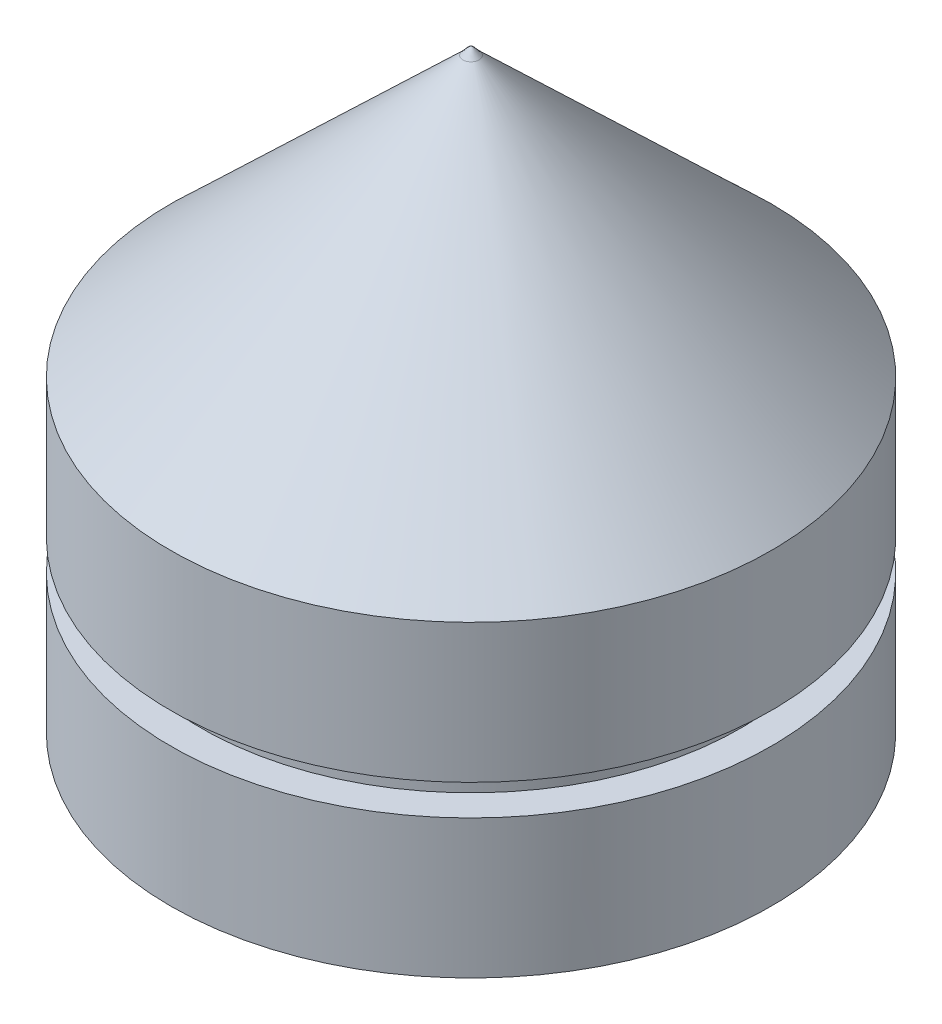
ISO-10303-21;
HEADER;
FILE_DESCRIPTION(('STEP AP214'),'2;1');
FILE_NAME('part.step','',(''),(''),'','','');
FILE_SCHEMA(('AUTOMOTIVE_DESIGN { 1 0 10303 214 1 1 1 1 }'));
ENDSEC;
DATA;
#1=APPLICATION_CONTEXT('core data for automotive mechanical design processes');
#2=APPLICATION_PROTOCOL_DEFINITION('international standard','automotive_design',2000,#1);
#3=PRODUCT_CONTEXT('',#1,'mechanical');
#4=PRODUCT('Part','Part','',(#3));
#5=PRODUCT_RELATED_PRODUCT_CATEGORY('part','',(#4));
#6=PRODUCT_DEFINITION_FORMATION('','',#4);
#7=PRODUCT_DEFINITION_CONTEXT('part definition',#1,'design');
#8=PRODUCT_DEFINITION('design','',#6,#7);
#9=PRODUCT_DEFINITION_SHAPE('','',#8);
#10=(LENGTH_UNIT() NAMED_UNIT(*) SI_UNIT(.MILLI.,.METRE.));
#11=(NAMED_UNIT(*) PLANE_ANGLE_UNIT() SI_UNIT($,.RADIAN.));
#12=(NAMED_UNIT(*) SI_UNIT($,.STERADIAN.) SOLID_ANGLE_UNIT());
#13=UNCERTAINTY_MEASURE_WITH_UNIT(LENGTH_MEASURE(1.E-05),#10,'distance_accuracy_value','');
#14=(GEOMETRIC_REPRESENTATION_CONTEXT(3) GLOBAL_UNCERTAINTY_ASSIGNED_CONTEXT((#13)) GLOBAL_UNIT_ASSIGNED_CONTEXT((#10,
#11,#12)) REPRESENTATION_CONTEXT('',''));
#15=CARTESIAN_POINT('',(0.,0.,0.));
#16=DIRECTION('',(0.,0.,1.));
#17=DIRECTION('',(1.,0.,0.));
#18=AXIS2_PLACEMENT_3D('',#15,#16,#17);
#19=CARTESIAN_POINT('',(0.,10.,0.));
#20=DIRECTION('',(0.,-1.,0.));
#21=DIRECTION('',(0.,0.,-1.));
#22=AXIS2_PLACEMENT_3D('',#19,#20,#21);
#23=CYLINDRICAL_SURFACE('',#22,9.75);
#24=CARTESIAN_POINT('',(0.,10.,0.));
#25=DIRECTION('',(0.,1.,0.));
#26=DIRECTION('',(0.,0.,1.));
#27=AXIS2_PLACEMENT_3D('',#24,#25,#26);
#28=CIRCLE('',#27,9.75);
#29=CARTESIAN_POINT('',(0.,10.,-9.75));
#30=VERTEX_POINT('',#29);
#31=EDGE_CURVE('E11',#30,#30,#28,.T.);
#32=ORIENTED_EDGE('',*,*,#31,.F.);
#33=EDGE_LOOP('',(#32));
#34=FACE_BOUND('',#33,.T.);
#35=CARTESIAN_POINT('',(0.,5.5,0.));
#36=DIRECTION('',(0.,-1.,0.));
#37=DIRECTION('',(0.,0.,-1.));
#38=AXIS2_PLACEMENT_3D('',#35,#36,#37);
#39=CIRCLE('',#38,9.75);
#40=CARTESIAN_POINT('',(0.,5.5,-9.75));
#41=VERTEX_POINT('',#40);
#42=EDGE_CURVE('E99',#41,#41,#39,.T.);
#43=ORIENTED_EDGE('',*,*,#42,.F.);
#44=EDGE_LOOP('',(#43));
#45=FACE_BOUND('',#44,.T.);
#46=ADVANCED_FACE('F39',(#34,#45),#23,.T.);
#47=CARTESIAN_POINT('',(0.,10.,0.));
#48=DIRECTION('',(0.,-1.,0.));
#49=DIRECTION('',(0.,0.,-1.));
#50=AXIS2_PLACEMENT_3D('',#47,#48,#49);
#51=CONICAL_SURFACE('',#50,9.75,0.809005552107021);
#52=CARTESIAN_POINT('',(0.,19.0501911681891,0.));
#53=DIRECTION('',(0.,1.,0.));
#54=DIRECTION('',(-1.,0.,0.));
#55=AXIS2_PLACEMENT_3D('',#52,#53,#54);
#56=CIRCLE('',#55,0.262091386716583);
#57=CARTESIAN_POINT('',(0.,19.0501911681891,-0.262091386716581));
#58=VERTEX_POINT('',#57);
#59=EDGE_CURVE('E57',#58,#58,#56,.T.);
#60=CARTESIAN_POINT('',(0.,19.0501911681891,-0.262091386716581));
#61=CARTESIAN_POINT('',(0.,18.9559183435205,-0.36092376810495));
#62=CARTESIAN_POINT('',(0.,18.8616455188518,-0.459756149493319));
#63=CARTESIAN_POINT('',(0.,18.6730998695146,-0.657420912270057));
#64=CARTESIAN_POINT('',(0.,18.5788270448459,-0.756253293658426));
#65=CARTESIAN_POINT('',(0.,18.3902813955087,-0.953918056435164));
#66=CARTESIAN_POINT('',(0.,18.29600857084,-1.05275043782353));
#67=CARTESIAN_POINT('',(0.,18.1074629215027,-1.25041520060027));
#68=CARTESIAN_POINT('',(0.,18.0131900968341,-1.34924758198864));
#69=CARTESIAN_POINT('',(0.,17.8246444474968,-1.54691234476538));
#70=CARTESIAN_POINT('',(0.,17.7303716228282,-1.64574472615375));
#71=CARTESIAN_POINT('',(0.,17.5418259734909,-1.84340948893048));
#72=CARTESIAN_POINT('',(0.,17.4475531488223,-1.94224187031885));
#73=CARTESIAN_POINT('',(0.,17.259007499485,-2.13990663309559));
#74=CARTESIAN_POINT('',(0.,17.1647346748164,-2.23873901448396));
#75=CARTESIAN_POINT('',(0.,16.9761890254791,-2.4364037772607));
#76=CARTESIAN_POINT('',(0.,16.8819162008105,-2.53523615864907));
#77=CARTESIAN_POINT('',(0.,16.6933705514732,-2.7329009214258));
#78=CARTESIAN_POINT('',(0.,16.5990977268046,-2.83173330281417));
#79=CARTESIAN_POINT('',(0.,16.4105520774673,-3.02939806559091));
#80=CARTESIAN_POINT('',(0.,16.3162792527987,-3.12823044697928));
#81=CARTESIAN_POINT('',(0.,16.1277336034614,-3.32589520975602));
#82=CARTESIAN_POINT('',(0.,16.0334607787927,-3.42472759114439));
#83=CARTESIAN_POINT('',(0.,15.8449151294555,-3.62239235392113));
#84=CARTESIAN_POINT('',(0.,15.7506423047868,-3.72122473530949));
#85=CARTESIAN_POINT('',(0.,15.5620966554496,-3.91888949808623));
#86=CARTESIAN_POINT('',(0.,15.4678238307809,-4.0177218794746));
#87=CARTESIAN_POINT('',(0.,15.2792781814436,-4.21538664225134));
#88=CARTESIAN_POINT('',(0.,15.185005356775,-4.31421902363971));
#89=CARTESIAN_POINT('',(0.,14.9964597074377,-4.51188378641645));
#90=CARTESIAN_POINT('',(0.,14.9021868827691,-4.61071616780482));
#91=CARTESIAN_POINT('',(0.,14.7136412334318,-4.80838093058155));
#92=CARTESIAN_POINT('',(0.,14.6193684087632,-4.90721331196992));
#93=CARTESIAN_POINT('',(0.,14.4308227594259,-5.10487807474666));
#94=CARTESIAN_POINT('',(0.,14.3365499347573,-5.20371045613503));
#95=CARTESIAN_POINT('',(0.,14.14800428542,-5.40137521891177));
#96=CARTESIAN_POINT('',(0.,14.0537314607514,-5.50020760030014));
#97=CARTESIAN_POINT('',(0.,13.8651858114141,-5.69787236307687));
#98=CARTESIAN_POINT('',(0.,13.7709129867455,-5.79670474446524));
#99=CARTESIAN_POINT('',(0.,13.5823673374082,-5.99436950724198));
#100=CARTESIAN_POINT('',(0.,13.4880945127396,-6.09320188863035));
#101=CARTESIAN_POINT('',(0.,13.2995488634023,-6.29086665140709));
#102=CARTESIAN_POINT('',(0.,13.2052760387336,-6.38969903279546));
#103=CARTESIAN_POINT('',(0.,13.0167303893964,-6.5873637955722));
#104=CARTESIAN_POINT('',(0.,12.9224575647277,-6.68619617696056));
#105=CARTESIAN_POINT('',(0.,12.7339119153905,-6.8838609397373));
#106=CARTESIAN_POINT('',(0.,12.6396390907218,-6.98269332112567));
#107=CARTESIAN_POINT('',(0.,12.4510934413845,-7.18035808390241));
#108=CARTESIAN_POINT('',(0.,12.3568206167159,-7.27919046529078));
#109=CARTESIAN_POINT('',(0.,12.1682749673786,-7.47685522806752));
#110=CARTESIAN_POINT('',(0.,12.07400214271,-7.57568760945588));
#111=CARTESIAN_POINT('',(0.,11.8854564933727,-7.77335237223262));
#112=CARTESIAN_POINT('',(0.,11.7911836687041,-7.87218475362099));
#113=CARTESIAN_POINT('',(0.,11.6026380193668,-8.06984951639773));
#114=CARTESIAN_POINT('',(0.,11.5083651946982,-8.1686818977861));
#115=CARTESIAN_POINT('',(0.,11.3198195453609,-8.36634666056283));
#116=CARTESIAN_POINT('',(0.,11.2255467206923,-8.4651790419512));
#117=CARTESIAN_POINT('',(0.,11.037001071355,-8.66284380472794));
#118=CARTESIAN_POINT('',(0.,10.9427282466864,-8.76167618611631));
#119=CARTESIAN_POINT('',(0.,10.7541825973491,-8.95934094889305));
#120=CARTESIAN_POINT('',(0.,10.6599097726805,-9.05817333028142));
#121=CARTESIAN_POINT('',(0.,10.4713641233432,-9.25583809305816));
#122=CARTESIAN_POINT('',(0.,10.3770912986745,-9.35467047444653));
#123=CARTESIAN_POINT('',(0.,10.1885456493373,-9.55233523722326));
#124=CARTESIAN_POINT('',(0.,10.0942728246686,-9.65116761861163));
#125=CARTESIAN_POINT('',(0.,10.,-9.75));
#126=B_SPLINE_CURVE_WITH_KNOTS('',3,(#60,#61,#62,#63,#64,#65,#66,#67,#68,#69,#70,#71,#72,#73,
#74,#75,#76,#77,#78,#79,#80,#81,#82,#83,#84,#85,#86,#87,#88,#89,#90,#91,#92,#93,#94,#95,#96,#97,
#98,#99,#100,#101,#102,#103,#104,#105,#106,#107,#108,#109,#110,#111,#112,#113,#114,#115,#116,
#117,#118,#119,#120,#121,#122,#123,#124,#125),.UNSPECIFIED.,.F.,.F.,(4,2,2,2,2,2,2,2,2,2,2,2,2,
2,2,2,2,2,2,2,2,2,2,2,2,2,2,2,2,2,2,2,4),(0.,0.409752176000439,0.819504352000878,
1.22925652800132,1.63900870400176,2.0487608800022,2.45851305600264,2.86826523200308,
3.27801740800352,3.68776958400396,4.0975217600044,4.50727393600484,4.91702611200528,
5.32677828800572,5.73653046400616,6.1462826400066,6.55603481600704,6.96578699200748,
7.37553916800792,7.78529134400836,8.1950435200088,8.60479569600924,9.01454787200968,
9.42430004801012,9.83405222401056,10.243804400011,10.6535565760114,11.0633087520119,
11.4730609280123,11.8828131040128,12.2925652800132,12.7023174560136,13.1120696320141),.UNSPECIFIED.);
#127=EDGE_CURVE('BSEAM53',#58,#30,#126,.T.);
#128=ORIENTED_EDGE('',*,*,#59,.F.);
#129=ORIENTED_EDGE('',*,*,#31,.T.);
#130=ORIENTED_EDGE('',*,*,#127,.T.);
#131=ORIENTED_EDGE('',*,*,#127,.F.);
#132=EDGE_LOOP('',(#128,#130,#129,#131));
#133=FACE_BOUND('',#132,.T.);
#134=ADVANCED_FACE('F53',(#133),#51,.T.);
#135=CARTESIAN_POINT('',(0.262091386716583,19.0501911681891,0.));
#136=CARTESIAN_POINT('',(0.134000153035224,19.1894724348722,0.));
#137=CARTESIAN_POINT('',(0.0703602224921844,19.2864984681918,0.));
#138=CARTESIAN_POINT('',(0.,19.3001911681891,0.));
#139=B_SPLINE_CURVE_WITH_KNOTS('',3,(#135,#136,#137,#138),.UNSPECIFIED.,.F.,.F.,(4,4),
(0.500000000033375,1.),.UNSPECIFIED.);
#140=CARTESIAN_POINT('',(0.,19.0501911681891,0.));
#141=DIRECTION('',(0.,1.,0.));
#142=AXIS1_PLACEMENT('',#140,#141);
#143=SURFACE_OF_REVOLUTION('',#139,#142);
#144=CARTESIAN_POINT('',(0.,19.3001911681891,0.));
#145=VERTEX_POINT('',#144);
#146=VERTEX_LOOP('',#145);
#147=FACE_BOUND('',#146,.T.);
#148=ORIENTED_EDGE('',*,*,#59,.T.);
#149=EDGE_LOOP('',(#148));
#150=FACE_BOUND('',#149,.T.);
#151=ADVANCED_FACE('F49',(#147,#150),#143,.T.);
#152=CARTESIAN_POINT('',(-8.75,4.5,0.));
#153=DIRECTION('',(0.,1.,0.));
#154=DIRECTION('',(0.,0.,1.));
#155=AXIS2_PLACEMENT_3D('',#152,#153,#154);
#156=PLANE('',#155);
#157=CARTESIAN_POINT('',(0.,4.5,0.));
#158=DIRECTION('',(0.,-1.,0.));
#159=DIRECTION('',(0.,0.,-1.));
#160=AXIS2_PLACEMENT_3D('',#157,#158,#159);
#161=CIRCLE('',#160,8.75);
#162=CARTESIAN_POINT('',(0.,4.5,-8.75));
#163=VERTEX_POINT('',#162);
#164=EDGE_CURVE('E59',#163,#163,#161,.T.);
#165=ORIENTED_EDGE('',*,*,#164,.T.);
#166=EDGE_LOOP('',(#165));
#167=FACE_BOUND('',#166,.T.);
#168=CARTESIAN_POINT('',(0.,4.5,0.));
#169=DIRECTION('',(0.,-1.,0.));
#170=DIRECTION('',(0.,0.,-1.));
#171=AXIS2_PLACEMENT_3D('',#168,#169,#170);
#172=CIRCLE('',#171,9.75);
#173=CARTESIAN_POINT('',(0.,4.5,-9.75));
#174=VERTEX_POINT('',#173);
#175=EDGE_CURVE('E100',#174,#174,#172,.T.);
#176=ORIENTED_EDGE('',*,*,#175,.F.);
#177=EDGE_LOOP('',(#176));
#178=FACE_BOUND('',#177,.T.);
#179=ADVANCED_FACE('F52',(#167,#178),#156,.T.);
#180=CARTESIAN_POINT('',(0.,0.,0.));
#181=DIRECTION('',(0.,-1.,0.));
#182=DIRECTION('',(0.,0.,-1.));
#183=AXIS2_PLACEMENT_3D('',#180,#181,#182);
#184=CYLINDRICAL_SURFACE('',#183,8.75);
#185=CARTESIAN_POINT('',(0.,5.5,0.));
#186=DIRECTION('',(0.,-1.,0.));
#187=DIRECTION('',(0.,0.,-1.));
#188=AXIS2_PLACEMENT_3D('',#185,#186,#187);
#189=CIRCLE('',#188,8.75);
#190=CARTESIAN_POINT('',(0.,5.5,-8.75));
#191=VERTEX_POINT('',#190);
#192=EDGE_CURVE('E63',#191,#191,#189,.T.);
#193=ORIENTED_EDGE('',*,*,#192,.T.);
#194=EDGE_LOOP('',(#193));
#195=FACE_BOUND('',#194,.T.);
#196=ORIENTED_EDGE('',*,*,#164,.F.);
#197=EDGE_LOOP('',(#196));
#198=FACE_BOUND('',#197,.T.);
#199=ADVANCED_FACE('F86',(#195,#198),#184,.T.);
#200=CARTESIAN_POINT('',(-9.75,5.5,0.));
#201=DIRECTION('',(0.,-1.,0.));
#202=DIRECTION('',(0.,0.,-1.));
#203=AXIS2_PLACEMENT_3D('',#200,#201,#202);
#204=PLANE('',#203);
#205=ORIENTED_EDGE('',*,*,#42,.T.);
#206=EDGE_LOOP('',(#205));
#207=FACE_BOUND('',#206,.T.);
#208=ORIENTED_EDGE('',*,*,#192,.F.);
#209=EDGE_LOOP('',(#208));
#210=FACE_BOUND('',#209,.T.);
#211=ADVANCED_FACE('F79',(#207,#210),#204,.T.);
#212=CARTESIAN_POINT('',(0.,0.,0.));
#213=DIRECTION('',(0.,1.,0.));
#214=DIRECTION('',(0.,0.,1.));
#215=AXIS2_PLACEMENT_3D('',#212,#213,#214);
#216=PLANE('',#215);
#217=CARTESIAN_POINT('',(0.,0.,0.));
#218=DIRECTION('',(0.,1.,0.));
#219=DIRECTION('',(0.,0.,1.));
#220=AXIS2_PLACEMENT_3D('',#217,#218,#219);
#221=CIRCLE('',#220,9.75);
#222=CARTESIAN_POINT('',(0.,0.,9.75));
#223=VERTEX_POINT('',#222);
#224=EDGE_CURVE('E43',#223,#223,#221,.T.);
#225=ORIENTED_EDGE('',*,*,#224,.F.);
#226=EDGE_LOOP('',(#225));
#227=FACE_BOUND('',#226,.T.);
#228=ADVANCED_FACE('F77',(#227),#216,.F.);
#229=ORIENTED_EDGE('',*,*,#224,.T.);
#230=EDGE_LOOP('',(#229));
#231=FACE_BOUND('',#230,.T.);
#232=ORIENTED_EDGE('',*,*,#175,.T.);
#233=EDGE_LOOP('',(#232));
#234=FACE_BOUND('',#233,.T.);
#235=ADVANCED_FACE('F41',(#231,#234),#23,.T.);
#236=CLOSED_SHELL('',(#46,#134,#151,#179,#199,#211,#228,#235));
#237=MANIFOLD_SOLID_BREP('B2',#236);
#238=ADVANCED_BREP_SHAPE_REPRESENTATION('',(#18,#237),#14);
#239=SHAPE_DEFINITION_REPRESENTATION(#9,#238);
ENDSEC;
END-ISO-10303-21;
